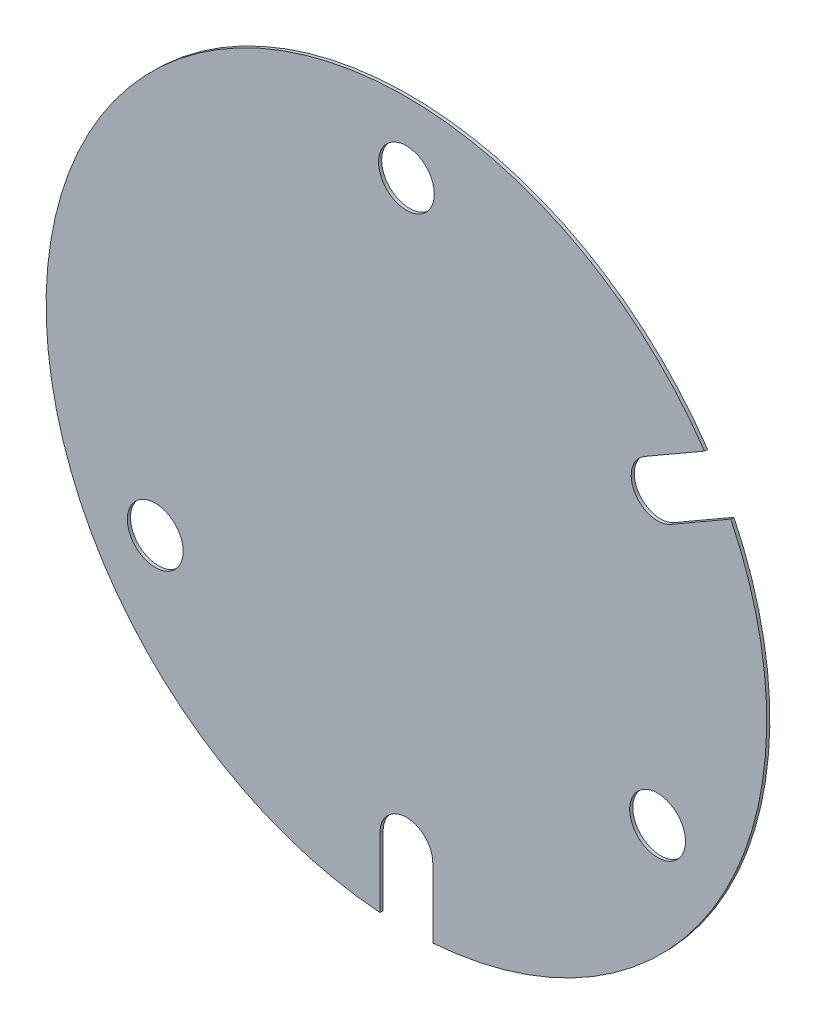
ISO-10303-21;
HEADER;
FILE_DESCRIPTION(('STEP AP214'),'2;1');
FILE_NAME('part.step','',(''),(''),'','','');
FILE_SCHEMA(('AUTOMOTIVE_DESIGN { 1 0 10303 214 1 1 1 1 }'));
ENDSEC;
DATA;
#1=APPLICATION_CONTEXT('core data for automotive mechanical design processes');
#2=APPLICATION_PROTOCOL_DEFINITION('international standard','automotive_design',2000,#1);
#3=PRODUCT_CONTEXT('',#1,'mechanical');
#4=PRODUCT('Part','Part','',(#3));
#5=PRODUCT_RELATED_PRODUCT_CATEGORY('part','',(#4));
#6=PRODUCT_DEFINITION_FORMATION('','',#4);
#7=PRODUCT_DEFINITION_CONTEXT('part definition',#1,'design');
#8=PRODUCT_DEFINITION('design','',#6,#7);
#9=PRODUCT_DEFINITION_SHAPE('','',#8);
#10=(LENGTH_UNIT() NAMED_UNIT(*) SI_UNIT(.MILLI.,.METRE.));
#11=(NAMED_UNIT(*) PLANE_ANGLE_UNIT() SI_UNIT($,.RADIAN.));
#12=(NAMED_UNIT(*) SI_UNIT($,.STERADIAN.) SOLID_ANGLE_UNIT());
#13=UNCERTAINTY_MEASURE_WITH_UNIT(LENGTH_MEASURE(1.E-05),#10,'distance_accuracy_value','');
#14=(GEOMETRIC_REPRESENTATION_CONTEXT(3) GLOBAL_UNCERTAINTY_ASSIGNED_CONTEXT((#13)) GLOBAL_UNIT_ASSIGNED_CONTEXT((#10,
#11,#12)) REPRESENTATION_CONTEXT('',''));
#15=CARTESIAN_POINT('',(0.,0.,0.));
#16=DIRECTION('',(0.,0.,1.));
#17=DIRECTION('',(1.,0.,0.));
#18=AXIS2_PLACEMENT_3D('',#15,#16,#17);
#19=CARTESIAN_POINT('',(0.,0.,0.1778));
#20=DIRECTION('',(0.,0.,-1.));
#21=DIRECTION('',(-1.,0.,0.));
#22=AXIS2_PLACEMENT_3D('',#19,#20,#21);
#23=CYLINDRICAL_SURFACE('',#22,20.5);
#24=DIRECTION('',(0.,0.,-1.));
#25=VECTOR('',#24,1.);
#26=CARTESIAN_POINT('',(18.4559312096259,8.92348604445361,0.1778));
#27=LINE('',#26,#25);
#28=CARTESIAN_POINT('',(18.4559312096259,8.92348604445361,0.1778));
#29=VERTEX_POINT('',#28);
#30=CARTESIAN_POINT('',(18.4559312096259,8.92348604445361,0.));
#31=VERTEX_POINT('',#30);
#32=EDGE_CURVE('E132',#29,#31,#27,.T.);
#33=ORIENTED_EDGE('',*,*,#32,.F.);
#34=CARTESIAN_POINT('',(0.,0.,0.1778));
#35=DIRECTION('',(0.,0.,1.));
#36=DIRECTION('',(1.,0.,0.));
#37=AXIS2_PLACEMENT_3D('',#34,#35,#36);
#38=CIRCLE('',#37,20.5);
#39=CARTESIAN_POINT('',(1.5,-20.4450483002609,0.1778));
#40=VERTEX_POINT('',#39);
#41=EDGE_CURVE('E11',#40,#29,#38,.T.);
#42=ORIENTED_EDGE('',*,*,#41,.F.);
#43=DIRECTION('',(0.,0.,-1.));
#44=VECTOR('',#43,1.);
#45=CARTESIAN_POINT('',(1.5,-20.4450483002609,0.1778));
#46=LINE('',#45,#44);
#47=CARTESIAN_POINT('',(1.5,-20.4450483002609,0.));
#48=VERTEX_POINT('',#47);
#49=EDGE_CURVE('E155',#40,#48,#46,.T.);
#50=ORIENTED_EDGE('',*,*,#49,.T.);
#51=CARTESIAN_POINT('',(0.,0.,0.));
#52=DIRECTION('',(0.,0.,1.));
#53=DIRECTION('',(1.,0.,0.));
#54=AXIS2_PLACEMENT_3D('',#51,#52,#53);
#55=CIRCLE('',#54,20.5);
#56=EDGE_CURVE('E40',#48,#31,#55,.T.);
#57=ORIENTED_EDGE('',*,*,#56,.T.);
#58=EDGE_LOOP('',(#33,#42,#50,#57));
#59=FACE_BOUND('',#58,.T.);
#60=ADVANCED_FACE('F36',(#59),#23,.T.);
#61=CARTESIAN_POINT('',(0.,-45.2414213562373,0.1778));
#62=DIRECTION('',(0.,0.,1.));
#63=DIRECTION('',(1.,0.,0.));
#64=AXIS2_PLACEMENT_3D('',#61,#62,#63);
#65=PLANE('',#64);
#66=CARTESIAN_POINT('',(-14.2894191624432,-8.25,0.1778));
#67=DIRECTION('',(0.,0.,1.));
#68=DIRECTION('',(1.,0.,0.));
#69=AXIS2_PLACEMENT_3D('',#66,#67,#68);
#70=CIRCLE('',#69,1.5875);
#71=CARTESIAN_POINT('',(-12.7019191624432,-8.25,0.1778));
#72=VERTEX_POINT('',#71);
#73=EDGE_CURVE('E161',#72,#72,#70,.T.);
#74=ORIENTED_EDGE('',*,*,#73,.F.);
#75=EDGE_LOOP('',(#74));
#76=FACE_BOUND('',#75,.T.);
#77=CARTESIAN_POINT('',(14.2894191624432,-8.25,0.1778));
#78=DIRECTION('',(0.,0.,1.));
#79=DIRECTION('',(1.,0.,0.));
#80=AXIS2_PLACEMENT_3D('',#77,#78,#79);
#81=CIRCLE('',#80,1.5875);
#82=CARTESIAN_POINT('',(15.8769191624432,-8.25,0.1778));
#83=VERTEX_POINT('',#82);
#84=EDGE_CURVE('E164',#83,#83,#81,.T.);
#85=ORIENTED_EDGE('',*,*,#84,.F.);
#86=EDGE_LOOP('',(#85));
#87=FACE_BOUND('',#86,.T.);
#88=CARTESIAN_POINT('',(0.,16.5,0.1778));
#89=DIRECTION('',(0.,0.,1.));
#90=DIRECTION('',(1.,0.,0.));
#91=AXIS2_PLACEMENT_3D('',#88,#89,#90);
#92=CIRCLE('',#91,1.5875);
#93=CARTESIAN_POINT('',(1.5875,16.5,0.1778));
#94=VERTEX_POINT('',#93);
#95=EDGE_CURVE('E167',#94,#94,#92,.T.);
#96=ORIENTED_EDGE('',*,*,#95,.F.);
#97=EDGE_LOOP('',(#96));
#98=FACE_BOUND('',#97,.T.);
#99=ORIENTED_EDGE('',*,*,#41,.T.);
#100=DIRECTION('',(0.866025403784443,0.499999999999992,0.));
#101=VECTOR('',#100,1.);
#102=CARTESIAN_POINT('',(0.749999999999984,-1.29903810567667,0.1778));
#103=LINE('',#102,#101);
#104=CARTESIAN_POINT('',(15.0394191624433,6.9509618943232,0.1778));
#105=VERTEX_POINT('',#104);
#106=EDGE_CURVE('E116',#105,#29,#103,.T.);
#107=ORIENTED_EDGE('',*,*,#106,.F.);
#108=CARTESIAN_POINT('',(14.2894191624433,8.24999999999987,0.1778));
#109=DIRECTION('',(0.,0.,-1.));
#110=DIRECTION('',(0.499999999999992,-0.866025403784443,0.));
#111=AXIS2_PLACEMENT_3D('',#108,#109,#110);
#112=CIRCLE('',#111,1.5);
#113=CARTESIAN_POINT('',(13.5394191624433,9.54903810567653,0.1778));
#114=VERTEX_POINT('',#113);
#115=EDGE_CURVE('E105',#114,#105,#112,.F.);
#116=ORIENTED_EDGE('',*,*,#115,.F.);
#117=DIRECTION('',(0.866025403784443,0.499999999999992,0.));
#118=VECTOR('',#117,1.);
#119=CARTESIAN_POINT('',(-0.749999999999993,1.29903810567666,0.1778));
#120=LINE('',#119,#118);
#121=CARTESIAN_POINT('',(16.9559312096259,11.5215622558069,0.1778));
#122=VERTEX_POINT('',#121);
#123=EDGE_CURVE('E115',#114,#122,#120,.T.);
#124=ORIENTED_EDGE('',*,*,#123,.T.);
#125=CARTESIAN_POINT('',(-1.5,-20.4450483002609,0.1778));
#126=VERTEX_POINT('',#125);
#127=EDGE_CURVE('E45',#122,#126,#38,.T.);
#128=ORIENTED_EDGE('',*,*,#127,.T.);
#129=DIRECTION('',(0.,-1.,0.));
#130=VECTOR('',#129,1.);
#131=CARTESIAN_POINT('',(-1.5,0.,0.1778));
#132=LINE('',#131,#130);
#133=CARTESIAN_POINT('',(-1.5,-16.5,0.1778));
#134=VERTEX_POINT('',#133);
#135=EDGE_CURVE('E138',#134,#126,#132,.T.);
#136=ORIENTED_EDGE('',*,*,#135,.F.);
#137=CARTESIAN_POINT('',(0.,-16.5,0.1778));
#138=DIRECTION('',(0.,0.,-1.));
#139=DIRECTION('',(-1.,0.,0.));
#140=AXIS2_PLACEMENT_3D('',#137,#138,#139);
#141=CIRCLE('',#140,1.5);
#142=CARTESIAN_POINT('',(1.5,-16.5,0.1778));
#143=VERTEX_POINT('',#142);
#144=EDGE_CURVE('E141',#143,#134,#141,.F.);
#145=ORIENTED_EDGE('',*,*,#144,.F.);
#146=DIRECTION('',(0.,-1.,0.));
#147=VECTOR('',#146,1.);
#148=CARTESIAN_POINT('',(1.5,0.,0.1778));
#149=LINE('',#148,#147);
#150=EDGE_CURVE('E144',#143,#40,#149,.T.);
#151=ORIENTED_EDGE('',*,*,#150,.T.);
#152=EDGE_LOOP('',(#99,#107,#116,#124,#128,#136,#145,#151));
#153=FACE_BOUND('',#152,.T.);
#154=ADVANCED_FACE('F121',(#76,#87,#98,#153),#65,.T.);
#155=CARTESIAN_POINT('',(0.,-45.2414213562373,0.));
#156=DIRECTION('',(0.,0.,1.));
#157=DIRECTION('',(1.,0.,0.));
#158=AXIS2_PLACEMENT_3D('',#155,#156,#157);
#159=PLANE('',#158);
#160=CARTESIAN_POINT('',(-14.2894191624432,-8.25,0.));
#161=DIRECTION('',(0.,0.,1.));
#162=DIRECTION('',(1.,0.,0.));
#163=AXIS2_PLACEMENT_3D('',#160,#161,#162);
#164=CIRCLE('',#163,1.5875);
#165=CARTESIAN_POINT('',(-12.7019191624432,-8.25,0.));
#166=VERTEX_POINT('',#165);
#167=EDGE_CURVE('E154',#166,#166,#164,.T.);
#168=ORIENTED_EDGE('',*,*,#167,.T.);
#169=EDGE_LOOP('',(#168));
#170=FACE_BOUND('',#169,.T.);
#171=CARTESIAN_POINT('',(14.2894191624432,-8.25,0.));
#172=DIRECTION('',(0.,0.,1.));
#173=DIRECTION('',(1.,0.,0.));
#174=AXIS2_PLACEMENT_3D('',#171,#172,#173);
#175=CIRCLE('',#174,1.5875);
#176=CARTESIAN_POINT('',(15.8769191624432,-8.25,0.));
#177=VERTEX_POINT('',#176);
#178=EDGE_CURVE('E172',#177,#177,#175,.T.);
#179=ORIENTED_EDGE('',*,*,#178,.T.);
#180=EDGE_LOOP('',(#179));
#181=FACE_BOUND('',#180,.T.);
#182=CARTESIAN_POINT('',(0.,16.5,0.));
#183=DIRECTION('',(0.,0.,1.));
#184=DIRECTION('',(1.,0.,0.));
#185=AXIS2_PLACEMENT_3D('',#182,#183,#184);
#186=CIRCLE('',#185,1.5875);
#187=CARTESIAN_POINT('',(1.5875,16.5,0.));
#188=VERTEX_POINT('',#187);
#189=EDGE_CURVE('E174',#188,#188,#186,.T.);
#190=ORIENTED_EDGE('',*,*,#189,.T.);
#191=EDGE_LOOP('',(#190));
#192=FACE_BOUND('',#191,.T.);
#193=DIRECTION('',(0.866025403784443,0.499999999999992,0.));
#194=VECTOR('',#193,1.);
#195=CARTESIAN_POINT('',(0.749999999999984,-1.29903810567667,0.));
#196=LINE('',#195,#194);
#197=CARTESIAN_POINT('',(15.0394191624433,6.9509618943232,0.));
#198=VERTEX_POINT('',#197);
#199=EDGE_CURVE('E53',#198,#31,#196,.T.);
#200=ORIENTED_EDGE('',*,*,#199,.T.);
#201=ORIENTED_EDGE('',*,*,#56,.F.);
#202=DIRECTION('',(0.,-1.,0.));
#203=VECTOR('',#202,1.);
#204=CARTESIAN_POINT('',(1.5,0.,0.));
#205=LINE('',#204,#203);
#206=CARTESIAN_POINT('',(1.5,-16.5,0.));
#207=VERTEX_POINT('',#206);
#208=EDGE_CURVE('E142',#207,#48,#205,.T.);
#209=ORIENTED_EDGE('',*,*,#208,.F.);
#210=CARTESIAN_POINT('',(0.,-16.5,0.));
#211=DIRECTION('',(0.,0.,-1.));
#212=DIRECTION('',(-1.,0.,0.));
#213=AXIS2_PLACEMENT_3D('',#210,#211,#212);
#214=CIRCLE('',#213,1.5);
#215=CARTESIAN_POINT('',(-1.5,-16.5,0.));
#216=VERTEX_POINT('',#215);
#217=EDGE_CURVE('E148',#207,#216,#214,.F.);
#218=ORIENTED_EDGE('',*,*,#217,.T.);
#219=DIRECTION('',(0.,-1.,0.));
#220=VECTOR('',#219,1.);
#221=CARTESIAN_POINT('',(-1.5,0.,0.));
#222=LINE('',#221,#220);
#223=CARTESIAN_POINT('',(-1.5,-20.4450483002609,0.));
#224=VERTEX_POINT('',#223);
#225=EDGE_CURVE('E61',#216,#224,#222,.T.);
#226=ORIENTED_EDGE('',*,*,#225,.T.);
#227=CARTESIAN_POINT('',(16.9559312096259,11.5215622558069,0.));
#228=VERTEX_POINT('',#227);
#229=EDGE_CURVE('E176',#228,#224,#55,.T.);
#230=ORIENTED_EDGE('',*,*,#229,.F.);
#231=DIRECTION('',(0.866025403784443,0.499999999999992,0.));
#232=VECTOR('',#231,1.);
#233=CARTESIAN_POINT('',(-0.749999999999993,1.29903810567666,0.));
#234=LINE('',#233,#232);
#235=CARTESIAN_POINT('',(13.5394191624433,9.54903810567653,0.));
#236=VERTEX_POINT('',#235);
#237=EDGE_CURVE('E124',#236,#228,#234,.T.);
#238=ORIENTED_EDGE('',*,*,#237,.F.);
#239=CARTESIAN_POINT('',(14.2894191624433,8.24999999999987,0.));
#240=DIRECTION('',(0.,0.,-1.));
#241=DIRECTION('',(0.499999999999992,-0.866025403784443,0.));
#242=AXIS2_PLACEMENT_3D('',#239,#240,#241);
#243=CIRCLE('',#242,1.5);
#244=EDGE_CURVE('E126',#236,#198,#243,.F.);
#245=ORIENTED_EDGE('',*,*,#244,.T.);
#246=EDGE_LOOP('',(#200,#201,#209,#218,#226,#230,#238,#245));
#247=FACE_BOUND('',#246,.T.);
#248=ADVANCED_FACE('F187',(#170,#181,#192,#247),#159,.F.);
#249=ORIENTED_EDGE('',*,*,#127,.F.);
#250=DIRECTION('',(0.,0.,-1.));
#251=VECTOR('',#250,1.);
#252=CARTESIAN_POINT('',(16.9559312096259,11.5215622558069,0.1778));
#253=LINE('',#252,#251);
#254=EDGE_CURVE('E134',#122,#228,#253,.T.);
#255=ORIENTED_EDGE('',*,*,#254,.T.);
#256=ORIENTED_EDGE('',*,*,#229,.T.);
#257=DIRECTION('',(0.,0.,-1.));
#258=VECTOR('',#257,1.);
#259=CARTESIAN_POINT('',(-1.5,-20.4450483002609,0.1778));
#260=LINE('',#259,#258);
#261=EDGE_CURVE('E152',#126,#224,#260,.T.);
#262=ORIENTED_EDGE('',*,*,#261,.F.);
#263=EDGE_LOOP('',(#249,#255,#256,#262));
#264=FACE_BOUND('',#263,.T.);
#265=ADVANCED_FACE('F192',(#264),#23,.T.);
#266=CARTESIAN_POINT('',(0.,16.5,0.1778));
#267=DIRECTION('',(0.,0.,-1.));
#268=DIRECTION('',(-1.,0.,0.));
#269=AXIS2_PLACEMENT_3D('',#266,#267,#268);
#270=CYLINDRICAL_SURFACE('',#269,1.5875);
#271=ORIENTED_EDGE('',*,*,#95,.T.);
#272=EDGE_LOOP('',(#271));
#273=FACE_BOUND('',#272,.T.);
#274=ORIENTED_EDGE('',*,*,#189,.F.);
#275=EDGE_LOOP('',(#274));
#276=FACE_BOUND('',#275,.T.);
#277=ADVANCED_FACE('F221',(#273,#276),#270,.F.);
#278=CARTESIAN_POINT('',(14.2894191624432,-8.25,0.1778));
#279=DIRECTION('',(0.,0.,-1.));
#280=DIRECTION('',(-1.,0.,0.));
#281=AXIS2_PLACEMENT_3D('',#278,#279,#280);
#282=CYLINDRICAL_SURFACE('',#281,1.5875);
#283=ORIENTED_EDGE('',*,*,#84,.T.);
#284=EDGE_LOOP('',(#283));
#285=FACE_BOUND('',#284,.T.);
#286=ORIENTED_EDGE('',*,*,#178,.F.);
#287=EDGE_LOOP('',(#286));
#288=FACE_BOUND('',#287,.T.);
#289=ADVANCED_FACE('F226',(#285,#288),#282,.F.);
#290=CARTESIAN_POINT('',(-14.2894191624432,-8.25,0.1778));
#291=DIRECTION('',(0.,0.,-1.));
#292=DIRECTION('',(-1.,0.,0.));
#293=AXIS2_PLACEMENT_3D('',#290,#291,#292);
#294=CYLINDRICAL_SURFACE('',#293,1.5875);
#295=ORIENTED_EDGE('',*,*,#73,.T.);
#296=EDGE_LOOP('',(#295));
#297=FACE_BOUND('',#296,.T.);
#298=ORIENTED_EDGE('',*,*,#167,.F.);
#299=EDGE_LOOP('',(#298));
#300=FACE_BOUND('',#299,.T.);
#301=ADVANCED_FACE('F38',(#297,#300),#294,.F.);
#302=CARTESIAN_POINT('',(-1.5,0.,0.1778));
#303=DIRECTION('',(1.,0.,0.));
#304=DIRECTION('',(0.,0.,-1.));
#305=AXIS2_PLACEMENT_3D('',#302,#303,#304);
#306=PLANE('',#305);
#307=ORIENTED_EDGE('',*,*,#225,.F.);
#308=DIRECTION('',(0.,0.,-1.));
#309=VECTOR('',#308,1.);
#310=CARTESIAN_POINT('',(-1.5,-16.5,0.1778));
#311=LINE('',#310,#309);
#312=EDGE_CURVE('E146',#134,#216,#311,.T.);
#313=ORIENTED_EDGE('',*,*,#312,.F.);
#314=ORIENTED_EDGE('',*,*,#135,.T.);
#315=ORIENTED_EDGE('',*,*,#261,.T.);
#316=EDGE_LOOP('',(#307,#313,#314,#315));
#317=FACE_BOUND('',#316,.T.);
#318=ADVANCED_FACE('F195',(#317),#306,.T.);
#319=CARTESIAN_POINT('',(1.5,0.,0.1778));
#320=DIRECTION('',(1.,0.,0.));
#321=DIRECTION('',(0.,0.,-1.));
#322=AXIS2_PLACEMENT_3D('',#319,#320,#321);
#323=PLANE('',#322);
#324=ORIENTED_EDGE('',*,*,#208,.T.);
#325=ORIENTED_EDGE('',*,*,#49,.F.);
#326=ORIENTED_EDGE('',*,*,#150,.F.);
#327=DIRECTION('',(0.,0.,-1.));
#328=VECTOR('',#327,1.);
#329=CARTESIAN_POINT('',(1.5,-16.5,0.1778));
#330=LINE('',#329,#328);
#331=EDGE_CURVE('E158',#143,#207,#330,.T.);
#332=ORIENTED_EDGE('',*,*,#331,.T.);
#333=EDGE_LOOP('',(#324,#325,#326,#332));
#334=FACE_BOUND('',#333,.T.);
#335=ADVANCED_FACE('F201',(#334),#323,.F.);
#336=CARTESIAN_POINT('',(0.,-16.5,0.1778));
#337=DIRECTION('',(0.,0.,-1.));
#338=DIRECTION('',(-1.,0.,0.));
#339=AXIS2_PLACEMENT_3D('',#336,#337,#338);
#340=CYLINDRICAL_SURFACE('',#339,1.5);
#341=ORIENTED_EDGE('',*,*,#217,.F.);
#342=ORIENTED_EDGE('',*,*,#331,.F.);
#343=ORIENTED_EDGE('',*,*,#144,.T.);
#344=ORIENTED_EDGE('',*,*,#312,.T.);
#345=EDGE_LOOP('',(#341,#342,#343,#344));
#346=FACE_BOUND('',#345,.T.);
#347=ADVANCED_FACE('F198',(#346),#340,.F.);
#348=CARTESIAN_POINT('',(0.749999999999984,-1.29903810567667,0.1778));
#349=DIRECTION('',(-0.499999999999992,0.866025403784443,0.));
#350=DIRECTION('',(-0.866025403784443,-0.499999999999992,0.));
#351=AXIS2_PLACEMENT_3D('',#348,#349,#350);
#352=PLANE('',#351);
#353=ORIENTED_EDGE('',*,*,#199,.F.);
#354=DIRECTION('',(0.,0.,-1.));
#355=VECTOR('',#354,1.);
#356=CARTESIAN_POINT('',(15.0394191624433,6.9509618943232,0.1778));
#357=LINE('',#356,#355);
#358=EDGE_CURVE('E108',#105,#198,#357,.T.);
#359=ORIENTED_EDGE('',*,*,#358,.F.);
#360=ORIENTED_EDGE('',*,*,#106,.T.);
#361=ORIENTED_EDGE('',*,*,#32,.T.);
#362=EDGE_LOOP('',(#353,#359,#360,#361));
#363=FACE_BOUND('',#362,.T.);
#364=ADVANCED_FACE('F118',(#363),#352,.T.);
#365=CARTESIAN_POINT('',(-0.749999999999993,1.29903810567666,0.1778));
#366=DIRECTION('',(-0.499999999999992,0.866025403784443,0.));
#367=DIRECTION('',(-0.866025403784443,-0.499999999999992,0.));
#368=AXIS2_PLACEMENT_3D('',#365,#366,#367);
#369=PLANE('',#368);
#370=ORIENTED_EDGE('',*,*,#237,.T.);
#371=ORIENTED_EDGE('',*,*,#254,.F.);
#372=ORIENTED_EDGE('',*,*,#123,.F.);
#373=DIRECTION('',(0.,0.,-1.));
#374=VECTOR('',#373,1.);
#375=CARTESIAN_POINT('',(13.5394191624433,9.54903810567653,0.1778));
#376=LINE('',#375,#374);
#377=EDGE_CURVE('E110',#114,#236,#376,.T.);
#378=ORIENTED_EDGE('',*,*,#377,.T.);
#379=EDGE_LOOP('',(#370,#371,#372,#378));
#380=FACE_BOUND('',#379,.T.);
#381=ADVANCED_FACE('F190',(#380),#369,.F.);
#382=CARTESIAN_POINT('',(14.2894191624433,8.24999999999987,0.1778));
#383=DIRECTION('',(0.,0.,-1.));
#384=DIRECTION('',(-1.,0.,0.));
#385=AXIS2_PLACEMENT_3D('',#382,#383,#384);
#386=CYLINDRICAL_SURFACE('',#385,1.5);
#387=ORIENTED_EDGE('',*,*,#244,.F.);
#388=ORIENTED_EDGE('',*,*,#377,.F.);
#389=ORIENTED_EDGE('',*,*,#115,.T.);
#390=ORIENTED_EDGE('',*,*,#358,.T.);
#391=EDGE_LOOP('',(#387,#388,#389,#390));
#392=FACE_BOUND('',#391,.T.);
#393=ADVANCED_FACE('F107',(#392),#386,.F.);
#394=CLOSED_SHELL('',(#60,#154,#248,#265,#277,#289,#301,#318,#335,#347,#364,#381,#393));
#395=MANIFOLD_SOLID_BREP('B2',#394);
#396=ADVANCED_BREP_SHAPE_REPRESENTATION('',(#18,#395),#14);
#397=SHAPE_DEFINITION_REPRESENTATION(#9,#396);
ENDSEC;
END-ISO-10303-21;
